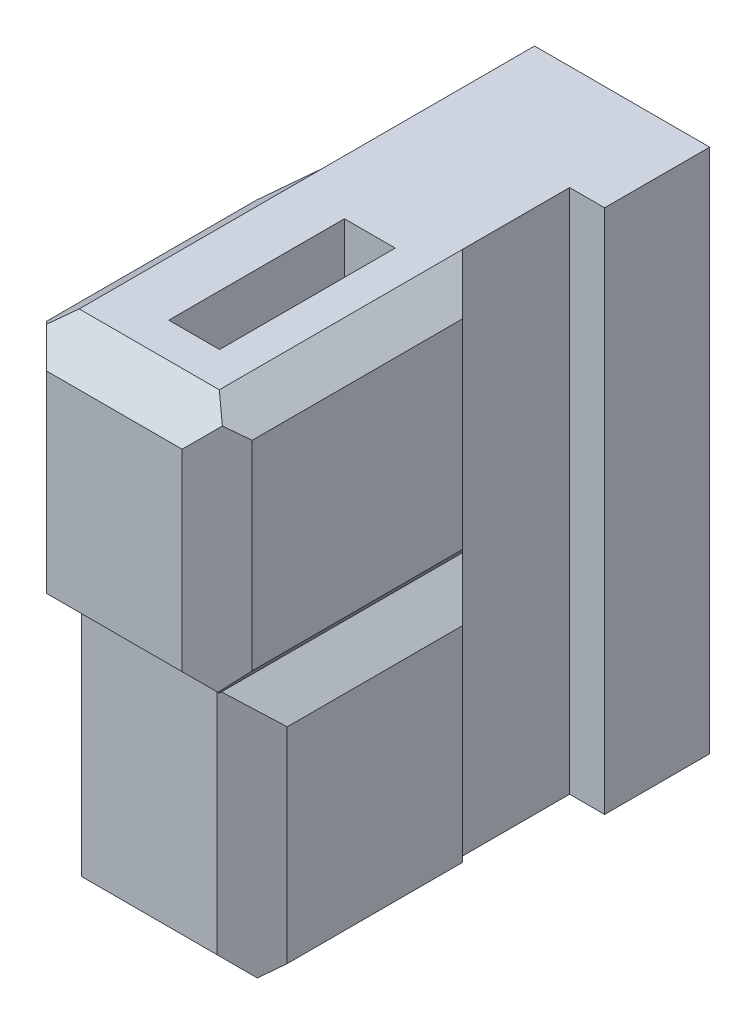
ISO-10303-21;
HEADER;
FILE_DESCRIPTION(('STEP AP214'),'2;1');
FILE_NAME('part.step','',(''),(''),'','','');
FILE_SCHEMA(('AUTOMOTIVE_DESIGN { 1 0 10303 214 1 1 1 1 }'));
ENDSEC;
DATA;
#1=APPLICATION_CONTEXT('core data for automotive mechanical design processes');
#2=APPLICATION_PROTOCOL_DEFINITION('international standard','automotive_design',2000,#1);
#3=PRODUCT_CONTEXT('',#1,'mechanical');
#4=PRODUCT('Part','Part','',(#3));
#5=PRODUCT_RELATED_PRODUCT_CATEGORY('part','',(#4));
#6=PRODUCT_DEFINITION_FORMATION('','',#4);
#7=PRODUCT_DEFINITION_CONTEXT('part definition',#1,'design');
#8=PRODUCT_DEFINITION('design','',#6,#7);
#9=PRODUCT_DEFINITION_SHAPE('','',#8);
#10=(LENGTH_UNIT() NAMED_UNIT(*) SI_UNIT(.MILLI.,.METRE.));
#11=(NAMED_UNIT(*) PLANE_ANGLE_UNIT() SI_UNIT($,.RADIAN.));
#12=(NAMED_UNIT(*) SI_UNIT($,.STERADIAN.) SOLID_ANGLE_UNIT());
#13=UNCERTAINTY_MEASURE_WITH_UNIT(LENGTH_MEASURE(1.E-05),#10,'distance_accuracy_value','');
#14=(GEOMETRIC_REPRESENTATION_CONTEXT(3) GLOBAL_UNCERTAINTY_ASSIGNED_CONTEXT((#13)) GLOBAL_UNIT_ASSIGNED_CONTEXT((#10,
#11,#12)) REPRESENTATION_CONTEXT('',''));
#15=CARTESIAN_POINT('',(0.,0.,0.));
#16=DIRECTION('',(0.,0.,1.));
#17=DIRECTION('',(1.,0.,0.));
#18=AXIS2_PLACEMENT_3D('',#15,#16,#17);
#19=CARTESIAN_POINT('',(3.68574548396804,12.5611885338296,13.));
#20=DIRECTION('',(-1.,0.,0.));
#21=DIRECTION('',(0.,-1.,0.));
#22=AXIS2_PLACEMENT_3D('',#19,#20,#21);
#23=PLANE('',#22);
#24=DIRECTION('',(0.,1.,0.));
#25=VECTOR('',#24,1.);
#26=CARTESIAN_POINT('',(3.68574548396804,12.5611885338296,6.06103746848479));
#27=LINE('',#26,#25);
#28=CARTESIAN_POINT('',(3.68574548396804,5.06118853382956,6.06103746848479));
#29=VERTEX_POINT('',#28);
#30=CARTESIAN_POINT('',(3.68574548396804,-2.43881146617044,6.06103746848479));
#31=VERTEX_POINT('',#30);
#32=EDGE_CURVE('E425',#29,#31,#27,.F.);
#33=ORIENTED_EDGE('',*,*,#32,.T.);
#34=DIRECTION('',(0.,0.,-1.));
#35=VECTOR('',#34,1.);
#36=CARTESIAN_POINT('',(3.68574548396804,-2.43881146617044,13.));
#37=LINE('',#36,#35);
#38=CARTESIAN_POINT('',(3.68574548396804,-2.43881146617044,3.));
#39=VERTEX_POINT('',#38);
#40=EDGE_CURVE('E336',#31,#39,#37,.T.);
#41=ORIENTED_EDGE('',*,*,#40,.T.);
#42=DIRECTION('',(0.,-1.,0.));
#43=VECTOR('',#42,1.);
#44=CARTESIAN_POINT('',(3.68574548396804,12.5611885338296,3.));
#45=LINE('',#44,#43);
#46=CARTESIAN_POINT('',(3.68574548396804,12.5611885338296,3.));
#47=VERTEX_POINT('',#46);
#48=EDGE_CURVE('E276',#47,#39,#45,.T.);
#49=ORIENTED_EDGE('',*,*,#48,.F.);
#50=DIRECTION('',(0.,0.,-1.));
#51=VECTOR('',#50,1.);
#52=CARTESIAN_POINT('',(3.68574548396804,12.5611885338296,13.));
#53=LINE('',#52,#51);
#54=CARTESIAN_POINT('',(3.68574548396804,12.5611885338296,6.06103746848479));
#55=VERTEX_POINT('',#54);
#56=EDGE_CURVE('E333',#55,#47,#53,.T.);
#57=ORIENTED_EDGE('',*,*,#56,.F.);
#58=DIRECTION('',(0.,1.,0.));
#59=VECTOR('',#58,1.);
#60=CARTESIAN_POINT('',(3.68574548396804,12.5611885338296,6.06103746848479));
#61=LINE('',#60,#59);
#62=EDGE_CURVE('E422',#55,#29,#61,.F.);
#63=ORIENTED_EDGE('',*,*,#62,.T.);
#64=EDGE_LOOP('',(#33,#41,#49,#57,#63));
#65=FACE_BOUND('',#64,.T.);
#66=ADVANCED_FACE('F34',(#65),#23,.F.);
#67=CARTESIAN_POINT('',(-0.31425451603196,12.5611885338296,13.));
#68=DIRECTION('',(1.,0.,0.));
#69=DIRECTION('',(0.,1.,0.));
#70=AXIS2_PLACEMENT_3D('',#67,#68,#69);
#71=PLANE('',#70);
#72=DIRECTION('',(0.,-1.,0.));
#73=VECTOR('',#72,1.);
#74=CARTESIAN_POINT('',(-0.31425451603196,12.5611885338296,6.06103746848479));
#75=LINE('',#74,#73);
#76=CARTESIAN_POINT('',(-0.314254516031959,5.06118853382956,6.06103746848479));
#77=VERTEX_POINT('',#76);
#78=CARTESIAN_POINT('',(-0.31425451603196,12.5611885338296,6.06103746848479));
#79=VERTEX_POINT('',#78);
#80=EDGE_CURVE('E438',#77,#79,#75,.F.);
#81=ORIENTED_EDGE('',*,*,#80,.T.);
#82=DIRECTION('',(0.,0.,-1.));
#83=VECTOR('',#82,1.);
#84=CARTESIAN_POINT('',(-0.31425451603196,12.5611885338296,13.));
#85=LINE('',#84,#83);
#86=CARTESIAN_POINT('',(-0.31425451603196,12.5611885338296,0.));
#87=VERTEX_POINT('',#86);
#88=EDGE_CURVE('E330',#79,#87,#85,.T.);
#89=ORIENTED_EDGE('',*,*,#88,.T.);
#90=DIRECTION('',(0.,-1.,0.));
#91=VECTOR('',#90,1.);
#92=CARTESIAN_POINT('',(-0.31425451603196,12.5611885338296,0.));
#93=LINE('',#92,#91);
#94=CARTESIAN_POINT('',(-0.314254516031958,-2.43881146617044,0.));
#95=VERTEX_POINT('',#94);
#96=EDGE_CURVE('E322',#87,#95,#93,.T.);
#97=ORIENTED_EDGE('',*,*,#96,.T.);
#98=DIRECTION('',(0.,0.,-1.));
#99=VECTOR('',#98,1.);
#100=CARTESIAN_POINT('',(-0.314254516031958,-2.43881146617044,13.));
#101=LINE('',#100,#99);
#102=CARTESIAN_POINT('',(-0.314254516031958,-2.43881146617044,6.06103746848479));
#103=VERTEX_POINT('',#102);
#104=EDGE_CURVE('E339',#103,#95,#101,.T.);
#105=ORIENTED_EDGE('',*,*,#104,.F.);
#106=DIRECTION('',(0.,-1.,0.));
#107=VECTOR('',#106,1.);
#108=CARTESIAN_POINT('',(-0.31425451603196,12.5611885338296,6.06103746848479));
#109=LINE('',#108,#107);
#110=EDGE_CURVE('E441',#103,#77,#109,.F.);
#111=ORIENTED_EDGE('',*,*,#110,.T.);
#112=EDGE_LOOP('',(#81,#89,#97,#105,#111));
#113=FACE_BOUND('',#112,.T.);
#114=ADVANCED_FACE('F518',(#113),#71,.F.);
#115=CARTESIAN_POINT('',(-0.314254516031958,-2.43881146617044,13.));
#116=DIRECTION('',(0.,1.,0.));
#117=DIRECTION('',(0.,0.,1.));
#118=AXIS2_PLACEMENT_3D('',#115,#116,#117);
#119=PLANE('',#118);
#120=DIRECTION('',(1.,0.,0.));
#121=VECTOR('',#120,1.);
#122=CARTESIAN_POINT('',(1.24324955469765,-2.43881146617044,6.98541748945029));
#123=LINE('',#122,#121);
#124=CARTESIAN_POINT('',(1.24324955469765,-2.43881146617044,6.98541748945029));
#125=VERTEX_POINT('',#124);
#126=CARTESIAN_POINT('',(2.69324955469765,-2.43881146617044,6.98541748945029));
#127=VERTEX_POINT('',#126);
#128=EDGE_CURVE('E241',#125,#127,#123,.T.);
#129=ORIENTED_EDGE('',*,*,#128,.F.);
#130=DIRECTION('',(0.,0.,-1.));
#131=VECTOR('',#130,1.);
#132=CARTESIAN_POINT('',(1.24324955469765,-2.43881146617044,12.));
#133=LINE('',#132,#131);
#134=CARTESIAN_POINT('',(1.24324955469765,-2.43881146617044,12.));
#135=VERTEX_POINT('',#134);
#136=EDGE_CURVE('E248',#135,#125,#133,.T.);
#137=ORIENTED_EDGE('',*,*,#136,.F.);
#138=DIRECTION('',(-1.,0.,0.));
#139=VECTOR('',#138,1.);
#140=CARTESIAN_POINT('',(-0.253217047547181,-2.43881146617044,12.));
#141=LINE('',#140,#139);
#142=CARTESIAN_POINT('',(-0.314254516031958,-2.43881146617044,12.));
#143=VERTEX_POINT('',#142);
#144=EDGE_CURVE('E463',#135,#143,#141,.T.);
#145=ORIENTED_EDGE('',*,*,#144,.T.);
#146=EDGE_CURVE('E340',#143,#103,#101,.T.);
#147=ORIENTED_EDGE('',*,*,#146,.T.);
#148=ORIENTED_EDGE('',*,*,#104,.T.);
#149=DIRECTION('',(1.,0.,0.));
#150=VECTOR('',#149,1.);
#151=CARTESIAN_POINT('',(-0.314254516031958,-2.43881146617044,0.));
#152=LINE('',#151,#150);
#153=CARTESIAN_POINT('',(4.68574548396804,-2.43881146617044,0.));
#154=VERTEX_POINT('',#153);
#155=EDGE_CURVE('E325',#95,#154,#152,.T.);
#156=ORIENTED_EDGE('',*,*,#155,.T.);
#157=DIRECTION('',(0.,0.,-1.));
#158=VECTOR('',#157,1.);
#159=CARTESIAN_POINT('',(4.68574548396804,-2.43881146617044,0.));
#160=LINE('',#159,#158);
#161=CARTESIAN_POINT('',(4.68574548396804,-2.43881146617044,3.));
#162=VERTEX_POINT('',#161);
#163=EDGE_CURVE('E311',#162,#154,#160,.T.);
#164=ORIENTED_EDGE('',*,*,#163,.F.);
#165=DIRECTION('',(-1.,0.,0.));
#166=VECTOR('',#165,1.);
#167=CARTESIAN_POINT('',(4.68574548396804,-2.43881146617044,3.));
#168=LINE('',#167,#166);
#169=EDGE_CURVE('E314',#162,#39,#168,.T.);
#170=ORIENTED_EDGE('',*,*,#169,.T.);
#171=ORIENTED_EDGE('',*,*,#40,.F.);
#172=CARTESIAN_POINT('',(3.68574548396804,-2.43881146617044,12.));
#173=VERTEX_POINT('',#172);
#174=EDGE_CURVE('E337',#173,#31,#37,.T.);
#175=ORIENTED_EDGE('',*,*,#174,.F.);
#176=CARTESIAN_POINT('',(2.69324955469765,-2.43881146617044,12.));
#177=VERTEX_POINT('',#176);
#178=EDGE_CURVE('E464',#173,#177,#141,.T.);
#179=ORIENTED_EDGE('',*,*,#178,.T.);
#180=DIRECTION('',(0.,0.,1.));
#181=VECTOR('',#180,1.);
#182=CARTESIAN_POINT('',(2.69324955469765,-2.43881146617044,12.));
#183=LINE('',#182,#181);
#184=EDGE_CURVE('E57',#127,#177,#183,.T.);
#185=ORIENTED_EDGE('',*,*,#184,.F.);
#186=EDGE_LOOP('',(#129,#137,#145,#147,#148,#156,#164,#170,#171,#175,#179,#185));
#187=FACE_BOUND('',#186,.T.);
#188=ADVANCED_FACE('F256',(#187),#119,.F.);
#189=CARTESIAN_POINT('',(-0.31425451603196,12.5611885338296,13.));
#190=DIRECTION('',(0.,-1.,0.));
#191=DIRECTION('',(0.,0.,-1.));
#192=AXIS2_PLACEMENT_3D('',#189,#190,#191);
#193=PLANE('',#192);
#194=DIRECTION('',(-1.,0.,0.));
#195=VECTOR('',#194,1.);
#196=CARTESIAN_POINT('',(-0.31425451603196,12.5611885338296,12.));
#197=LINE('',#196,#195);
#198=CARTESIAN_POINT('',(2.69324955469765,12.5611885338296,12.));
#199=VERTEX_POINT('',#198);
#200=CARTESIAN_POINT('',(1.24324955469765,12.5611885338296,12.));
#201=VERTEX_POINT('',#200);
#202=EDGE_CURVE('E263',#199,#201,#197,.T.);
#203=ORIENTED_EDGE('',*,*,#202,.T.);
#204=DIRECTION('',(0.,0.,-1.));
#205=VECTOR('',#204,1.);
#206=CARTESIAN_POINT('',(1.24324955469765,12.5611885338296,13.));
#207=LINE('',#206,#205);
#208=CARTESIAN_POINT('',(1.24324955469765,12.5611885338296,6.98541748945029));
#209=VERTEX_POINT('',#208);
#210=EDGE_CURVE('E11',#201,#209,#207,.T.);
#211=ORIENTED_EDGE('',*,*,#210,.T.);
#212=DIRECTION('',(1.,0.,0.));
#213=VECTOR('',#212,1.);
#214=CARTESIAN_POINT('',(-0.31425451603196,12.5611885338296,6.98541748945029));
#215=LINE('',#214,#213);
#216=CARTESIAN_POINT('',(2.69324955469765,12.5611885338296,6.98541748945029));
#217=VERTEX_POINT('',#216);
#218=EDGE_CURVE('E243',#209,#217,#215,.T.);
#219=ORIENTED_EDGE('',*,*,#218,.T.);
#220=DIRECTION('',(0.,0.,1.));
#221=VECTOR('',#220,1.);
#222=CARTESIAN_POINT('',(2.69324955469765,12.5611885338296,13.));
#223=LINE('',#222,#221);
#224=EDGE_CURVE('E43',#217,#199,#223,.T.);
#225=ORIENTED_EDGE('',*,*,#224,.T.);
#226=EDGE_LOOP('',(#203,#211,#219,#225));
#227=FACE_BOUND('',#226,.T.);
#228=CARTESIAN_POINT('',(-0.31425451603196,12.5611885338296,13.));
#229=VERTEX_POINT('',#228);
#230=EDGE_CURVE('E331',#229,#79,#85,.T.);
#231=ORIENTED_EDGE('',*,*,#230,.F.);
#232=DIRECTION('',(1.,0.,0.));
#233=VECTOR('',#232,1.);
#234=CARTESIAN_POINT('',(-0.31425451603196,12.5611885338296,13.));
#235=LINE('',#234,#233);
#236=CARTESIAN_POINT('',(3.68574548396804,12.5611885338296,13.));
#237=VERTEX_POINT('',#236);
#238=EDGE_CURVE('E450',#229,#237,#235,.T.);
#239=ORIENTED_EDGE('',*,*,#238,.T.);
#240=EDGE_CURVE('E334',#237,#55,#53,.T.);
#241=ORIENTED_EDGE('',*,*,#240,.T.);
#242=ORIENTED_EDGE('',*,*,#56,.T.);
#243=DIRECTION('',(-1.,0.,0.));
#244=VECTOR('',#243,1.);
#245=CARTESIAN_POINT('',(4.68574548396804,12.5611885338296,3.));
#246=LINE('',#245,#244);
#247=CARTESIAN_POINT('',(4.68574548396804,12.5611885338296,3.));
#248=VERTEX_POINT('',#247);
#249=EDGE_CURVE('E319',#248,#47,#246,.T.);
#250=ORIENTED_EDGE('',*,*,#249,.F.);
#251=DIRECTION('',(0.,0.,1.));
#252=VECTOR('',#251,1.);
#253=CARTESIAN_POINT('',(4.68574548396804,12.5611885338296,0.));
#254=LINE('',#253,#252);
#255=CARTESIAN_POINT('',(4.68574548396804,12.5611885338296,0.));
#256=VERTEX_POINT('',#255);
#257=EDGE_CURVE('E307',#256,#248,#254,.T.);
#258=ORIENTED_EDGE('',*,*,#257,.F.);
#259=DIRECTION('',(-1.,0.,0.));
#260=VECTOR('',#259,1.);
#261=CARTESIAN_POINT('',(-0.31425451603196,12.5611885338296,0.));
#262=LINE('',#261,#260);
#263=EDGE_CURVE('E327',#256,#87,#262,.T.);
#264=ORIENTED_EDGE('',*,*,#263,.T.);
#265=ORIENTED_EDGE('',*,*,#88,.F.);
#266=EDGE_LOOP('',(#231,#239,#241,#242,#250,#258,#264,#265));
#267=FACE_BOUND('',#266,.T.);
#268=ADVANCED_FACE('F472',(#227,#267),#193,.F.);
#269=CARTESIAN_POINT('',(0.,0.,13.));
#270=DIRECTION('',(0.,0.,1.));
#271=DIRECTION('',(1.,0.,0.));
#272=AXIS2_PLACEMENT_3D('',#269,#270,#271);
#273=PLANE('',#272);
#274=DIRECTION('',(0.,-1.,0.));
#275=VECTOR('',#274,1.);
#276=CARTESIAN_POINT('',(-0.253217047547181,0.,13.));
#277=LINE('',#276,#275);
#278=CARTESIAN_POINT('',(-0.253217047547181,5.06118853382956,13.));
#279=VERTEX_POINT('',#278);
#280=CARTESIAN_POINT('',(-0.253217047547181,-1.43881146617044,13.));
#281=VERTEX_POINT('',#280);
#282=EDGE_CURVE('E379',#279,#281,#277,.T.);
#283=ORIENTED_EDGE('',*,*,#282,.T.);
#284=DIRECTION('',(1.,0.,0.));
#285=VECTOR('',#284,1.);
#286=CARTESIAN_POINT('',(3.62470801548326,-1.43881146617044,13.));
#287=LINE('',#286,#285);
#288=CARTESIAN_POINT('',(3.62470801548326,-1.43881146617044,13.));
#289=VERTEX_POINT('',#288);
#290=EDGE_CURVE('E456',#281,#289,#287,.T.);
#291=ORIENTED_EDGE('',*,*,#290,.T.);
#292=DIRECTION('',(0.,1.,0.));
#293=VECTOR('',#292,1.);
#294=CARTESIAN_POINT('',(3.62470801548326,0.,13.));
#295=LINE('',#294,#293);
#296=CARTESIAN_POINT('',(3.62470801548326,5.06118853382956,13.));
#297=VERTEX_POINT('',#296);
#298=EDGE_CURVE('E382',#289,#297,#295,.T.);
#299=ORIENTED_EDGE('',*,*,#298,.T.);
#300=DIRECTION('',(1.,0.,0.));
#301=VECTOR('',#300,1.);
#302=CARTESIAN_POINT('',(-0.314254516031959,5.06118853382956,13.));
#303=LINE('',#302,#301);
#304=EDGE_CURVE('E269',#279,#297,#303,.T.);
#305=ORIENTED_EDGE('',*,*,#304,.F.);
#306=EDGE_LOOP('',(#283,#291,#299,#305));
#307=FACE_BOUND('',#306,.T.);
#308=ADVANCED_FACE('F494',(#307),#273,.T.);
#309=CARTESIAN_POINT('',(0.,0.,0.));
#310=DIRECTION('',(0.,0.,1.));
#311=DIRECTION('',(1.,0.,0.));
#312=AXIS2_PLACEMENT_3D('',#309,#310,#311);
#313=PLANE('',#312);
#314=ORIENTED_EDGE('',*,*,#96,.F.);
#315=ORIENTED_EDGE('',*,*,#263,.F.);
#316=DIRECTION('',(0.,1.,0.));
#317=VECTOR('',#316,1.);
#318=CARTESIAN_POINT('',(4.68574548396804,12.5611885338296,0.));
#319=LINE('',#318,#317);
#320=EDGE_CURVE('E304',#154,#256,#319,.T.);
#321=ORIENTED_EDGE('',*,*,#320,.F.);
#322=ORIENTED_EDGE('',*,*,#155,.F.);
#323=EDGE_LOOP('',(#314,#315,#321,#322));
#324=FACE_BOUND('',#323,.T.);
#325=ADVANCED_FACE('F522',(#324),#313,.F.);
#326=CARTESIAN_POINT('',(4.68574548396804,12.5611885338296,3.));
#327=DIRECTION('',(0.,0.,-1.));
#328=DIRECTION('',(0.,1.,0.));
#329=AXIS2_PLACEMENT_3D('',#326,#327,#328);
#330=PLANE('',#329);
#331=ORIENTED_EDGE('',*,*,#48,.T.);
#332=ORIENTED_EDGE('',*,*,#169,.F.);
#333=DIRECTION('',(0.,-1.,0.));
#334=VECTOR('',#333,1.);
#335=CARTESIAN_POINT('',(4.68574548396804,12.5611885338296,3.));
#336=LINE('',#335,#334);
#337=EDGE_CURVE('E309',#248,#162,#336,.T.);
#338=ORIENTED_EDGE('',*,*,#337,.F.);
#339=ORIENTED_EDGE('',*,*,#249,.T.);
#340=EDGE_LOOP('',(#331,#332,#338,#339));
#341=FACE_BOUND('',#340,.T.);
#342=ADVANCED_FACE('F532',(#341),#330,.F.);
#343=CARTESIAN_POINT('',(4.68574548396804,0.,0.));
#344=DIRECTION('',(-1.,0.,0.));
#345=DIRECTION('',(0.,-1.,0.));
#346=AXIS2_PLACEMENT_3D('',#343,#344,#345);
#347=PLANE('',#346);
#348=ORIENTED_EDGE('',*,*,#320,.T.);
#349=ORIENTED_EDGE('',*,*,#257,.T.);
#350=ORIENTED_EDGE('',*,*,#337,.T.);
#351=ORIENTED_EDGE('',*,*,#163,.T.);
#352=EDGE_LOOP('',(#348,#349,#350,#351));
#353=FACE_BOUND('',#352,.T.);
#354=ADVANCED_FACE('F527',(#353),#347,.F.);
#355=CARTESIAN_POINT('',(4.62470801548326,-1.65643513010278,6.));
#356=DIRECTION('',(0.640139761828641,-0.768258475596574,0.));
#357=DIRECTION('',(0.768258475596574,0.640139761828641,0.));
#358=AXIS2_PLACEMENT_3D('',#355,#356,#357);
#359=PLANE('',#358);
#360=DIRECTION('',(0.609226248130286,0.507628562216694,-0.609226248130288));
#361=VECTOR('',#360,1.);
#362=CARTESIAN_POINT('',(6.8516477439487,0.199128736315513,9.77306027153456));
#363=LINE('',#362,#361);
#364=CARTESIAN_POINT('',(4.62470801548326,-1.65643513010278,12.));
#365=VERTEX_POINT('',#364);
#366=CARTESIAN_POINT('',(4.19793436913944,-2.01203781982662,12.4267736463438));
#367=VERTEX_POINT('',#366);
#368=EDGE_CURVE('E374',#365,#367,#363,.F.);
#369=ORIENTED_EDGE('',*,*,#368,.T.);
#370=DIRECTION('',(-0.647041080495098,-0.539137199677287,-0.539137199677289));
#371=VECTOR('',#370,1.);
#372=CARTESIAN_POINT('',(2.25871729317026,-3.62786113525569,10.8109503309147));
#373=LINE('',#372,#371);
#374=EDGE_CURVE('E461',#367,#173,#373,.T.);
#375=ORIENTED_EDGE('',*,*,#374,.T.);
#376=ORIENTED_EDGE('',*,*,#174,.T.);
#377=DIRECTION('',(-0.609226248130284,-0.507628562216692,-0.609226248130291));
#378=VECTOR('',#377,1.);
#379=CARTESIAN_POINT('',(4.25355139407235,-1.96569577450584,6.6288433785891));
#380=LINE('',#379,#378);
#381=CARTESIAN_POINT('',(4.62470801548326,-1.65643513010278,7.00000000000002));
#382=VERTEX_POINT('',#381);
#383=EDGE_CURVE('E377',#31,#382,#380,.F.);
#384=ORIENTED_EDGE('',*,*,#383,.T.);
#385=DIRECTION('',(0.,0.,1.));
#386=VECTOR('',#385,1.);
#387=CARTESIAN_POINT('',(4.62470801548326,-1.65643513010278,6.));
#388=LINE('',#387,#386);
#389=EDGE_CURVE('E286',#382,#365,#388,.T.);
#390=ORIENTED_EDGE('',*,*,#389,.T.);
#391=EDGE_LOOP('',(#369,#375,#376,#384,#390));
#392=FACE_BOUND('',#391,.T.);
#393=ADVANCED_FACE('F485',(#392),#359,.T.);
#394=CARTESIAN_POINT('',(4.62470801548326,4.19760023647882,6.));
#395=DIRECTION('',(1.,0.,0.));
#396=DIRECTION('',(0.,1.,0.));
#397=AXIS2_PLACEMENT_3D('',#394,#395,#396);
#398=PLANE('',#397);
#399=ORIENTED_EDGE('',*,*,#389,.F.);
#400=DIRECTION('',(0.,1.,0.));
#401=VECTOR('',#400,1.);
#402=CARTESIAN_POINT('',(4.62470801548326,4.19760023647882,7.00000000000002));
#403=LINE('',#402,#401);
#404=CARTESIAN_POINT('',(4.62470801548326,4.19760023647882,7.00000000000002));
#405=VERTEX_POINT('',#404);
#406=EDGE_CURVE('E371',#382,#405,#403,.T.);
#407=ORIENTED_EDGE('',*,*,#406,.T.);
#408=DIRECTION('',(0.,0.,1.));
#409=VECTOR('',#408,1.);
#410=CARTESIAN_POINT('',(4.62470801548326,4.19760023647882,6.));
#411=LINE('',#410,#409);
#412=CARTESIAN_POINT('',(4.62470801548326,4.19760023647882,12.));
#413=VERTEX_POINT('',#412);
#414=EDGE_CURVE('E283',#405,#413,#411,.T.);
#415=ORIENTED_EDGE('',*,*,#414,.T.);
#416=DIRECTION('',(0.,-1.,0.));
#417=VECTOR('',#416,1.);
#418=CARTESIAN_POINT('',(4.62470801548326,4.19760023647882,12.));
#419=LINE('',#418,#417);
#420=EDGE_CURVE('E369',#413,#365,#419,.T.);
#421=ORIENTED_EDGE('',*,*,#420,.T.);
#422=EDGE_LOOP('',(#399,#407,#415,#421));
#423=FACE_BOUND('',#422,.T.);
#424=ADVANCED_FACE('F542',(#423),#398,.T.);
#425=CARTESIAN_POINT('',(3.68574548396804,5.06118853382956,6.));
#426=DIRECTION('',(0.676947317310232,0.736031473230921,0.));
#427=DIRECTION('',(-0.736031473230921,0.676947317310232,0.));
#428=AXIS2_PLACEMENT_3D('',#425,#426,#427);
#429=PLANE('',#428);
#430=ORIENTED_EDGE('',*,*,#414,.F.);
#431=DIRECTION('',(0.592775829963962,-0.545191370824103,0.592775829963968));
#432=VECTOR('',#431,1.);
#433=CARTESIAN_POINT('',(3.66429794391258,5.08091439506172,6.03958992842932));
#434=LINE('',#433,#432);
#435=EDGE_CURVE('E362',#405,#29,#434,.F.);
#436=ORIENTED_EDGE('',*,*,#435,.T.);
#437=DIRECTION('',(0.,0.,1.));
#438=VECTOR('',#437,1.);
#439=CARTESIAN_POINT('',(3.68574548396804,5.06118853382956,6.));
#440=LINE('',#439,#438);
#441=CARTESIAN_POINT('',(3.68574548396804,5.06118853382956,12.9389625315152));
#442=VERTEX_POINT('',#441);
#443=EDGE_CURVE('E282',#29,#442,#440,.T.);
#444=ORIENTED_EDGE('',*,*,#443,.T.);
#445=DIRECTION('',(-0.592775829963964,0.545191370824104,0.592775829963966));
#446=VECTOR('',#445,1.);
#447=CARTESIAN_POINT('',(6.12398023603885,2.81868052375556,10.5007277794444));
#448=LINE('',#447,#446);
#449=EDGE_CURVE('E360',#442,#413,#448,.F.);
#450=ORIENTED_EDGE('',*,*,#449,.T.);
#451=EDGE_LOOP('',(#430,#436,#444,#450));
#452=FACE_BOUND('',#451,.T.);
#453=ADVANCED_FACE('F545',(#452),#429,.T.);
#454=CARTESIAN_POINT('',(4.62470801548326,6.08210398427526,6.));
#455=DIRECTION('',(0.736031473230921,-0.676947317310232,0.));
#456=DIRECTION('',(0.676947317310232,0.736031473230921,0.));
#457=AXIS2_PLACEMENT_3D('',#454,#455,#456);
#458=PLANE('',#457);
#459=ORIENTED_EDGE('',*,*,#443,.F.);
#460=DIRECTION('',(-0.560580177517939,-0.609507776117668,-0.560580177517945));
#461=VECTOR('',#460,1.);
#462=CARTESIAN_POINT('',(4.3104578800572,5.74042600694064,6.68574986457396));
#463=LINE('',#462,#461);
#464=CARTESIAN_POINT('',(4.62470801548326,6.08210398427526,7.00000000000002));
#465=VERTEX_POINT('',#464);
#466=EDGE_CURVE('E367',#29,#465,#463,.F.);
#467=ORIENTED_EDGE('',*,*,#466,.T.);
#468=DIRECTION('',(0.,0.,1.));
#469=VECTOR('',#468,1.);
#470=CARTESIAN_POINT('',(4.62470801548326,6.08210398427526,6.));
#471=LINE('',#470,#469);
#472=CARTESIAN_POINT('',(4.62470801548326,6.08210398427526,13.));
#473=VERTEX_POINT('',#472);
#474=EDGE_CURVE('E277',#465,#473,#471,.T.);
#475=ORIENTED_EDGE('',*,*,#474,.T.);
#476=DIRECTION('',(-0.560580177517941,-0.609507776117669,0.560580177517943));
#477=VECTOR('',#476,1.);
#478=CARTESIAN_POINT('',(6.82445896346558,8.47384982561752,10.8002490520177));
#479=LINE('',#478,#477);
#480=CARTESIAN_POINT('',(4.13559524181232,5.55030130750049,13.4891127736709));
#481=VERTEX_POINT('',#480);
#482=EDGE_CURVE('E365',#473,#481,#479,.T.);
#483=ORIENTED_EDGE('',*,*,#482,.T.);
#484=DIRECTION('',(0.545191370824104,0.592775829963963,0.592775829963966));
#485=VECTOR('',#484,1.);
#486=CARTESIAN_POINT('',(2.0325384996431,3.26368916997479,11.2025006361452));
#487=LINE('',#486,#485);
#488=CARTESIAN_POINT('',(3.65650290026984,5.02939364904298,12.9682051152134));
#489=VERTEX_POINT('',#488);
#490=EDGE_CURVE('E345',#481,#489,#487,.F.);
#491=ORIENTED_EDGE('',*,*,#490,.T.);
#492=DIRECTION('',(-0.56058017751794,-0.609507776117669,0.560580177517943));
#493=VECTOR('',#492,1.);
#494=CARTESIAN_POINT('',(1.91808675734524,3.13924804679838,14.706621258138));
#495=LINE('',#494,#493);
#496=EDGE_CURVE('E431',#489,#442,#495,.F.);
#497=ORIENTED_EDGE('',*,*,#496,.T.);
#498=EDGE_LOOP('',(#459,#467,#475,#483,#491,#497));
#499=FACE_BOUND('',#498,.T.);
#500=ADVANCED_FACE('F550',(#499),#458,.T.);
#501=CARTESIAN_POINT('',(4.62470801548326,11.7821039842753,6.));
#502=DIRECTION('',(1.,0.,0.));
#503=DIRECTION('',(0.,1.,0.));
#504=AXIS2_PLACEMENT_3D('',#501,#502,#503);
#505=PLANE('',#504);
#506=ORIENTED_EDGE('',*,*,#474,.F.);
#507=DIRECTION('',(0.,1.,0.));
#508=VECTOR('',#507,1.);
#509=CARTESIAN_POINT('',(4.62470801548326,11.7821039842753,7.00000000000002));
#510=LINE('',#509,#508);
#511=CARTESIAN_POINT('',(4.62470801548326,11.7821039842753,7.00000000000002));
#512=VERTEX_POINT('',#511);
#513=EDGE_CURVE('E352',#465,#512,#510,.T.);
#514=ORIENTED_EDGE('',*,*,#513,.T.);
#515=DIRECTION('',(0.,0.,1.));
#516=VECTOR('',#515,1.);
#517=CARTESIAN_POINT('',(4.62470801548326,11.7821039842753,6.));
#518=LINE('',#517,#516);
#519=CARTESIAN_POINT('',(4.62470801548326,11.7821039842753,13.));
#520=VERTEX_POINT('',#519);
#521=EDGE_CURVE('E273',#512,#520,#518,.T.);
#522=ORIENTED_EDGE('',*,*,#521,.T.);
#523=DIRECTION('',(0.,-1.,0.));
#524=VECTOR('',#523,1.);
#525=CARTESIAN_POINT('',(4.62470801548326,6.08210398427526,13.));
#526=LINE('',#525,#524);
#527=EDGE_CURVE('E350',#520,#473,#526,.T.);
#528=ORIENTED_EDGE('',*,*,#527,.T.);
#529=EDGE_LOOP('',(#506,#514,#522,#528));
#530=FACE_BOUND('',#529,.T.);
#531=ADVANCED_FACE('F558',(#530),#505,.T.);
#532=CARTESIAN_POINT('',(4.62470801548326,11.7821039842753,6.));
#533=DIRECTION('',(0.638545980128091,0.769583673983703,0.));
#534=DIRECTION('',(-0.769583673983703,0.638545980128091,0.));
#535=AXIS2_PLACEMENT_3D('',#532,#533,#534);
#536=PLANE('',#535);
#537=ORIENTED_EDGE('',*,*,#240,.F.);
#538=DIRECTION('',(-0.648626175911402,0.538184022395013,-0.538184022395012));
#539=VECTOR('',#538,1.);
#540=CARTESIAN_POINT('',(1.90918327985121,14.0352539177976,11.525934616032));
#541=LINE('',#540,#539);
#542=CARTESIAN_POINT('',(4.19891572551963,12.1353962438659,13.4257922899636));
#543=VERTEX_POINT('',#542);
#544=EDGE_CURVE('E452',#237,#543,#541,.F.);
#545=ORIENTED_EDGE('',*,*,#544,.T.);
#546=DIRECTION('',(0.60988645125398,-0.506040544970115,-0.609886451253982));
#547=VECTOR('',#546,1.);
#548=CARTESIAN_POINT('',(7.22843839944548,9.62171307913808,10.3962696160378));
#549=LINE('',#548,#547);
#550=EDGE_CURVE('E355',#543,#520,#549,.T.);
#551=ORIENTED_EDGE('',*,*,#550,.T.);
#552=ORIENTED_EDGE('',*,*,#521,.F.);
#553=DIRECTION('',(0.609886451253979,-0.506040544970113,0.609886451253985));
#554=VECTOR('',#553,1.);
#555=CARTESIAN_POINT('',(4.25274653206007,12.0907312564377,6.62803851657683));
#556=LINE('',#555,#554);
#557=EDGE_CURVE('E357',#512,#55,#556,.F.);
#558=ORIENTED_EDGE('',*,*,#557,.T.);
#559=EDGE_LOOP('',(#537,#545,#551,#552,#558));
#560=FACE_BOUND('',#559,.T.);
#561=ADVANCED_FACE('F562',(#560),#536,.T.);
#562=CARTESIAN_POINT('',(-1.25321704754718,11.7821039842753,6.));
#563=DIRECTION('',(-0.638545980128091,0.769583673983703,0.));
#564=DIRECTION('',(-0.769583673983703,-0.638545980128091,0.));
#565=AXIS2_PLACEMENT_3D('',#562,#563,#564);
#566=PLANE('',#565);
#567=DIRECTION('',(0.60988645125398,0.506040544970115,0.609886451253982));
#568=VECTOR('',#567,1.);
#569=CARTESIAN_POINT('',(-3.8569474315094,9.62171307913808,10.3962696160378));
#570=LINE('',#569,#568);
#571=CARTESIAN_POINT('',(-1.25321704754718,11.7821039842753,13.));
#572=VERTEX_POINT('',#571);
#573=CARTESIAN_POINT('',(-0.827424757583561,12.1353962438659,13.4257922899636));
#574=VERTEX_POINT('',#573);
#575=EDGE_CURVE('E405',#572,#574,#570,.T.);
#576=ORIENTED_EDGE('',*,*,#575,.T.);
#577=DIRECTION('',(-0.648626175911402,-0.538184022395013,0.538184022395012));
#578=VECTOR('',#577,1.);
#579=CARTESIAN_POINT('',(1.46230768808487,14.0352539177976,11.525934616032));
#580=LINE('',#579,#578);
#581=EDGE_CURVE('E448',#574,#229,#580,.F.);
#582=ORIENTED_EDGE('',*,*,#581,.T.);
#583=ORIENTED_EDGE('',*,*,#230,.T.);
#584=DIRECTION('',(0.609886451253979,0.506040544970113,-0.609886451253985));
#585=VECTOR('',#584,1.);
#586=CARTESIAN_POINT('',(-0.881255564123996,12.0907312564377,6.62803851657683));
#587=LINE('',#586,#585);
#588=CARTESIAN_POINT('',(-1.25321704754718,11.7821039842753,7.00000000000002));
#589=VERTEX_POINT('',#588);
#590=EDGE_CURVE('E403',#79,#589,#587,.F.);
#591=ORIENTED_EDGE('',*,*,#590,.T.);
#592=DIRECTION('',(0.,0.,1.));
#593=VECTOR('',#592,1.);
#594=CARTESIAN_POINT('',(-1.25321704754718,11.7821039842753,6.));
#595=LINE('',#594,#593);
#596=EDGE_CURVE('E272',#589,#572,#595,.T.);
#597=ORIENTED_EDGE('',*,*,#596,.T.);
#598=EDGE_LOOP('',(#576,#582,#583,#591,#597));
#599=FACE_BOUND('',#598,.T.);
#600=ADVANCED_FACE('F717',(#599),#566,.T.);
#601=CARTESIAN_POINT('',(-1.25321704754718,-1.65643513010278,6.));
#602=DIRECTION('',(-0.640139761828641,-0.768258475596574,0.));
#603=DIRECTION('',(0.768258475596574,-0.640139761828641,0.));
#604=AXIS2_PLACEMENT_3D('',#601,#602,#603);
#605=PLANE('',#604);
#606=ORIENTED_EDGE('',*,*,#146,.F.);
#607=DIRECTION('',(-0.647041080495098,0.539137199677287,0.539137199677289));
#608=VECTOR('',#607,1.);
#609=CARTESIAN_POINT('',(1.11277367476582,-3.62786113525569,10.8109503309147));
#610=LINE('',#609,#608);
#611=CARTESIAN_POINT('',(-0.826443401203355,-2.01203781982662,12.4267736463438));
#612=VERTEX_POINT('',#611);
#613=EDGE_CURVE('E466',#143,#612,#610,.T.);
#614=ORIENTED_EDGE('',*,*,#613,.T.);
#615=DIRECTION('',(0.609226248130286,-0.507628562216694,0.609226248130288));
#616=VECTOR('',#615,1.);
#617=CARTESIAN_POINT('',(-3.48015677601261,0.199128736315512,9.77306027153456));
#618=LINE('',#617,#616);
#619=CARTESIAN_POINT('',(-1.25321704754718,-1.65643513010278,12.));
#620=VERTEX_POINT('',#619);
#621=EDGE_CURVE('E411',#612,#620,#618,.F.);
#622=ORIENTED_EDGE('',*,*,#621,.T.);
#623=DIRECTION('',(0.,0.,1.));
#624=VECTOR('',#623,1.);
#625=CARTESIAN_POINT('',(-1.25321704754718,-1.65643513010278,6.));
#626=LINE('',#625,#624);
#627=CARTESIAN_POINT('',(-1.25321704754718,-1.65643513010278,7.00000000000002));
#628=VERTEX_POINT('',#627);
#629=EDGE_CURVE('E289',#628,#620,#626,.T.);
#630=ORIENTED_EDGE('',*,*,#629,.F.);
#631=DIRECTION('',(-0.609226248130285,0.507628562216693,0.609226248130291));
#632=VECTOR('',#631,1.);
#633=CARTESIAN_POINT('',(-0.882060426136264,-1.96569577450584,6.6288433785891));
#634=LINE('',#633,#632);
#635=EDGE_CURVE('E408',#628,#103,#634,.F.);
#636=ORIENTED_EDGE('',*,*,#635,.T.);
#637=EDGE_LOOP('',(#606,#614,#622,#630,#636));
#638=FACE_BOUND('',#637,.T.);
#639=ADVANCED_FACE('F512',(#638),#605,.T.);
#640=CARTESIAN_POINT('',(-1.25321704754718,4.19760023647882,6.));
#641=DIRECTION('',(-1.,0.,0.));
#642=DIRECTION('',(0.,0.,1.));
#643=AXIS2_PLACEMENT_3D('',#640,#641,#642);
#644=PLANE('',#643);
#645=ORIENTED_EDGE('',*,*,#629,.T.);
#646=DIRECTION('',(0.,1.,0.));
#647=VECTOR('',#646,1.);
#648=CARTESIAN_POINT('',(-1.25321704754718,4.19760023647882,12.));
#649=LINE('',#648,#647);
#650=CARTESIAN_POINT('',(-1.25321704754718,4.19760023647882,12.));
#651=VERTEX_POINT('',#650);
#652=EDGE_CURVE('E416',#620,#651,#649,.T.);
#653=ORIENTED_EDGE('',*,*,#652,.T.);
#654=DIRECTION('',(0.,0.,1.));
#655=VECTOR('',#654,1.);
#656=CARTESIAN_POINT('',(-1.25321704754718,4.19760023647882,6.));
#657=LINE('',#656,#655);
#658=CARTESIAN_POINT('',(-1.25321704754718,4.19760023647882,7.00000000000002));
#659=VERTEX_POINT('',#658);
#660=EDGE_CURVE('E292',#659,#651,#657,.T.);
#661=ORIENTED_EDGE('',*,*,#660,.F.);
#662=DIRECTION('',(0.,-1.,0.));
#663=VECTOR('',#662,1.);
#664=CARTESIAN_POINT('',(-1.25321704754718,4.19760023647882,7.00000000000002));
#665=LINE('',#664,#663);
#666=EDGE_CURVE('E413',#659,#628,#665,.T.);
#667=ORIENTED_EDGE('',*,*,#666,.T.);
#668=EDGE_LOOP('',(#645,#653,#661,#667));
#669=FACE_BOUND('',#668,.T.);
#670=ADVANCED_FACE('F599',(#669),#644,.T.);
#671=CARTESIAN_POINT('',(-0.314254516031959,5.06118853382956,6.));
#672=DIRECTION('',(-0.676947317310232,0.736031473230921,0.));
#673=DIRECTION('',(-0.736031473230921,-0.676947317310232,0.));
#674=AXIS2_PLACEMENT_3D('',#671,#672,#673);
#675=PLANE('',#674);
#676=ORIENTED_EDGE('',*,*,#660,.T.);
#677=DIRECTION('',(-0.592775829963963,-0.545191370824104,-0.592775829963966));
#678=VECTOR('',#677,1.);
#679=CARTESIAN_POINT('',(-2.75248926810277,2.81868052375556,10.5007277794444));
#680=LINE('',#679,#678);
#681=CARTESIAN_POINT('',(-0.314254516031959,5.06118853382956,12.9389625315152));
#682=VERTEX_POINT('',#681);
#683=EDGE_CURVE('E420',#651,#682,#680,.F.);
#684=ORIENTED_EDGE('',*,*,#683,.T.);
#685=DIRECTION('',(0.,0.,1.));
#686=VECTOR('',#685,1.);
#687=CARTESIAN_POINT('',(-0.314254516031959,5.06118853382956,6.));
#688=LINE('',#687,#686);
#689=EDGE_CURVE('E298',#77,#682,#688,.T.);
#690=ORIENTED_EDGE('',*,*,#689,.F.);
#691=DIRECTION('',(0.592775829963962,0.545191370824103,-0.592775829963968));
#692=VECTOR('',#691,1.);
#693=CARTESIAN_POINT('',(-0.292806975976495,5.08091439506172,6.03958992842932));
#694=LINE('',#693,#692);
#695=EDGE_CURVE('E418',#77,#659,#694,.F.);
#696=ORIENTED_EDGE('',*,*,#695,.T.);
#697=EDGE_LOOP('',(#676,#684,#690,#696));
#698=FACE_BOUND('',#697,.T.);
#699=ADVANCED_FACE('F593',(#698),#675,.T.);
#700=CARTESIAN_POINT('',(-1.25321704754718,6.08210398427526,6.));
#701=DIRECTION('',(-0.736031473230921,-0.676947317310232,0.));
#702=DIRECTION('',(0.676947317310232,-0.736031473230921,0.));
#703=AXIS2_PLACEMENT_3D('',#700,#701,#702);
#704=PLANE('',#703);
#705=DIRECTION('',(0.545191370824104,-0.592775829963963,-0.592775829963966));
#706=VECTOR('',#705,1.);
#707=CARTESIAN_POINT('',(1.33895246829298,3.26368916997479,11.2025006361452));
#708=LINE('',#707,#706);
#709=CARTESIAN_POINT('',(-0.285011932333762,5.02939364904298,12.9682051152134));
#710=VERTEX_POINT('',#709);
#711=CARTESIAN_POINT('',(-0.764104273876245,5.55030130750049,13.4891127736709));
#712=VERTEX_POINT('',#711);
#713=EDGE_CURVE('E347',#710,#712,#708,.F.);
#714=ORIENTED_EDGE('',*,*,#713,.T.);
#715=DIRECTION('',(-0.560580177517941,0.609507776117669,-0.560580177517942));
#716=VECTOR('',#715,1.);
#717=CARTESIAN_POINT('',(-3.4529679955295,8.47384982561752,10.8002490520177));
#718=LINE('',#717,#716);
#719=CARTESIAN_POINT('',(-1.25321704754718,6.08210398427526,13.));
#720=VERTEX_POINT('',#719);
#721=EDGE_CURVE('E396',#712,#720,#718,.T.);
#722=ORIENTED_EDGE('',*,*,#721,.T.);
#723=DIRECTION('',(0.,0.,1.));
#724=VECTOR('',#723,1.);
#725=CARTESIAN_POINT('',(-1.25321704754718,6.08210398427526,6.));
#726=LINE('',#725,#724);
#727=CARTESIAN_POINT('',(-1.25321704754718,6.08210398427526,7.00000000000002));
#728=VERTEX_POINT('',#727);
#729=EDGE_CURVE('E299',#728,#720,#726,.T.);
#730=ORIENTED_EDGE('',*,*,#729,.F.);
#731=DIRECTION('',(-0.560580177517939,0.609507776117668,0.560580177517945));
#732=VECTOR('',#731,1.);
#733=CARTESIAN_POINT('',(-0.938966912121124,5.74042600694064,6.68574986457396));
#734=LINE('',#733,#732);
#735=EDGE_CURVE('E393',#728,#77,#734,.F.);
#736=ORIENTED_EDGE('',*,*,#735,.T.);
#737=ORIENTED_EDGE('',*,*,#689,.T.);
#738=DIRECTION('',(-0.560580177517941,0.609507776117669,-0.560580177517943));
#739=VECTOR('',#738,1.);
#740=CARTESIAN_POINT('',(1.45340421059085,3.13924804679838,14.706621258138));
#741=LINE('',#740,#739);
#742=EDGE_CURVE('E433',#682,#710,#741,.F.);
#743=ORIENTED_EDGE('',*,*,#742,.T.);
#744=EDGE_LOOP('',(#714,#722,#730,#736,#737,#743));
#745=FACE_BOUND('',#744,.T.);
#746=ADVANCED_FACE('F587',(#745),#704,.T.);
#747=CARTESIAN_POINT('',(-1.25321704754718,11.7821039842753,6.));
#748=DIRECTION('',(-1.,0.,0.));
#749=DIRECTION('',(0.,-1.,0.));
#750=AXIS2_PLACEMENT_3D('',#747,#748,#749);
#751=PLANE('',#750);
#752=ORIENTED_EDGE('',*,*,#729,.T.);
#753=DIRECTION('',(0.,1.,0.));
#754=VECTOR('',#753,1.);
#755=CARTESIAN_POINT('',(-1.25321704754718,11.7821039842753,13.));
#756=LINE('',#755,#754);
#757=EDGE_CURVE('E401',#720,#572,#756,.T.);
#758=ORIENTED_EDGE('',*,*,#757,.T.);
#759=ORIENTED_EDGE('',*,*,#596,.F.);
#760=DIRECTION('',(0.,-1.,0.));
#761=VECTOR('',#760,1.);
#762=CARTESIAN_POINT('',(-1.25321704754718,11.7821039842753,7.00000000000002));
#763=LINE('',#762,#761);
#764=EDGE_CURVE('E398',#589,#728,#763,.T.);
#765=ORIENTED_EDGE('',*,*,#764,.T.);
#766=EDGE_LOOP('',(#752,#758,#759,#765));
#767=FACE_BOUND('',#766,.T.);
#768=ADVANCED_FACE('F750',(#767),#751,.T.);
#769=CARTESIAN_POINT('',(0.,0.,14.));
#770=DIRECTION('',(0.,0.,-1.));
#771=DIRECTION('',(-1.,0.,0.));
#772=AXIS2_PLACEMENT_3D('',#769,#770,#771);
#773=PLANE('',#772);
#774=DIRECTION('',(0.,1.,0.));
#775=VECTOR('',#774,1.);
#776=CARTESIAN_POINT('',(3.62470801548325,11.7821039842753,14.));
#777=LINE('',#776,#775);
#778=CARTESIAN_POINT('',(3.62470801548326,6.06118853382956,14.));
#779=VERTEX_POINT('',#778);
#780=CARTESIAN_POINT('',(3.62470801548325,11.5611885338296,14.));
#781=VERTEX_POINT('',#780);
#782=EDGE_CURVE('E386',#779,#781,#777,.T.);
#783=ORIENTED_EDGE('',*,*,#782,.T.);
#784=DIRECTION('',(-1.,0.,0.));
#785=VECTOR('',#784,1.);
#786=CARTESIAN_POINT('',(0.,11.5611885338296,14.));
#787=LINE('',#786,#785);
#788=CARTESIAN_POINT('',(-0.253217047547179,11.5611885338296,14.));
#789=VERTEX_POINT('',#788);
#790=EDGE_CURVE('E443',#781,#789,#787,.T.);
#791=ORIENTED_EDGE('',*,*,#790,.T.);
#792=DIRECTION('',(0.,-1.,0.));
#793=VECTOR('',#792,1.);
#794=CARTESIAN_POINT('',(-0.253217047547178,6.08210398427526,14.));
#795=LINE('',#794,#793);
#796=CARTESIAN_POINT('',(-0.253217047547178,6.06118853382956,14.));
#797=VERTEX_POINT('',#796);
#798=EDGE_CURVE('E384',#789,#797,#795,.T.);
#799=ORIENTED_EDGE('',*,*,#798,.T.);
#800=DIRECTION('',(1.,0.,0.));
#801=VECTOR('',#800,1.);
#802=CARTESIAN_POINT('',(0.,6.06118853382956,14.));
#803=LINE('',#802,#801);
#804=EDGE_CURVE('E342',#797,#779,#803,.T.);
#805=ORIENTED_EDGE('',*,*,#804,.T.);
#806=EDGE_LOOP('',(#783,#791,#799,#805));
#807=FACE_BOUND('',#806,.T.);
#808=ADVANCED_FACE('F577',(#807),#773,.F.);
#809=CARTESIAN_POINT('',(0.,6.06118853382956,14.));
#810=DIRECTION('',(0.,0.707106781186549,-0.707106781186546));
#811=DIRECTION('',(1.,0.,0.));
#812=AXIS2_PLACEMENT_3D('',#809,#810,#811);
#813=PLANE('',#812);
#814=ORIENTED_EDGE('',*,*,#490,.F.);
#815=DIRECTION('',(0.577350269189625,-0.577350269189625,-0.577350269189627));
#816=VECTOR('',#815,1.);
#817=CARTESIAN_POINT('',(2.41647201032217,7.26942453899064,15.2082360051611));
#818=LINE('',#817,#816);
#819=EDGE_CURVE('E391',#481,#779,#818,.F.);
#820=ORIENTED_EDGE('',*,*,#819,.T.);
#821=ORIENTED_EDGE('',*,*,#804,.F.);
#822=DIRECTION('',(0.577350269189625,0.577350269189625,0.577350269189627));
#823=VECTOR('',#822,1.);
#824=CARTESIAN_POINT('',(-0.168811365031452,6.14559421634529,14.0844056825157));
#825=LINE('',#824,#823);
#826=EDGE_CURVE('E389',#797,#712,#825,.F.);
#827=ORIENTED_EDGE('',*,*,#826,.T.);
#828=ORIENTED_EDGE('',*,*,#713,.F.);
#829=DIRECTION('',(0.577350269189625,0.577350269189625,0.577350269189627));
#830=VECTOR('',#829,1.);
#831=CARTESIAN_POINT('',(-1.94027989215703,3.37412568921971,11.3129371553901));
#832=LINE('',#831,#830);
#833=EDGE_CURVE('E436',#710,#279,#832,.T.);
#834=ORIENTED_EDGE('',*,*,#833,.T.);
#835=ORIENTED_EDGE('',*,*,#304,.T.);
#836=DIRECTION('',(0.577350269189625,-0.577350269189625,-0.577350269189627));
#837=VECTOR('',#836,1.);
#838=CARTESIAN_POINT('',(5.31177086009311,3.37412568921971,11.3129371553901));
#839=LINE('',#838,#837);
#840=EDGE_CURVE('E428',#297,#489,#839,.T.);
#841=ORIENTED_EDGE('',*,*,#840,.T.);
#842=EDGE_LOOP('',(#814,#820,#821,#827,#828,#834,#835,#841));
#843=FACE_BOUND('',#842,.T.);
#844=ADVANCED_FACE('F503',(#843),#813,.F.);
#845=CARTESIAN_POINT('',(4.62470801548326,11.7821039842753,7.00000000000002));
#846=DIRECTION('',(-0.707106781186551,0.,0.707106781186544));
#847=DIRECTION('',(0.,1.,0.));
#848=AXIS2_PLACEMENT_3D('',#845,#846,#847);
#849=PLANE('',#848);
#850=ORIENTED_EDGE('',*,*,#466,.F.);
#851=ORIENTED_EDGE('',*,*,#62,.F.);
#852=ORIENTED_EDGE('',*,*,#557,.F.);
#853=ORIENTED_EDGE('',*,*,#513,.F.);
#854=EDGE_LOOP('',(#850,#851,#852,#853));
#855=FACE_BOUND('',#854,.T.);
#856=ADVANCED_FACE('F555',(#855),#849,.F.);
#857=CARTESIAN_POINT('',(4.62470801548326,4.19760023647882,7.00000000000002));
#858=DIRECTION('',(-0.707106781186551,0.,0.707106781186544));
#859=DIRECTION('',(0.,1.,0.));
#860=AXIS2_PLACEMENT_3D('',#857,#858,#859);
#861=PLANE('',#860);
#862=ORIENTED_EDGE('',*,*,#383,.F.);
#863=ORIENTED_EDGE('',*,*,#32,.F.);
#864=ORIENTED_EDGE('',*,*,#435,.F.);
#865=ORIENTED_EDGE('',*,*,#406,.F.);
#866=EDGE_LOOP('',(#862,#863,#864,#865));
#867=FACE_BOUND('',#866,.T.);
#868=ADVANCED_FACE('F539',(#867),#861,.F.);
#869=CARTESIAN_POINT('',(3.62470801548326,0.,13.));
#870=DIRECTION('',(-0.707106781186549,0.,-0.707106781186546));
#871=DIRECTION('',(0.,1.,0.));
#872=AXIS2_PLACEMENT_3D('',#869,#870,#871);
#873=PLANE('',#872);
#874=ORIENTED_EDGE('',*,*,#298,.F.);
#875=DIRECTION('',(-0.577350269189625,0.577350269189625,0.577350269189627));
#876=VECTOR('',#875,1.);
#877=CARTESIAN_POINT('',(3.14510419342645,-0.95920764411363,13.4796038220568));
#878=LINE('',#877,#876);
#879=EDGE_CURVE('E459',#289,#367,#878,.F.);
#880=ORIENTED_EDGE('',*,*,#879,.T.);
#881=ORIENTED_EDGE('',*,*,#368,.F.);
#882=ORIENTED_EDGE('',*,*,#420,.F.);
#883=ORIENTED_EDGE('',*,*,#449,.F.);
#884=ORIENTED_EDGE('',*,*,#496,.F.);
#885=ORIENTED_EDGE('',*,*,#840,.F.);
#886=EDGE_LOOP('',(#874,#880,#881,#882,#883,#884,#885));
#887=FACE_BOUND('',#886,.T.);
#888=ADVANCED_FACE('F498',(#887),#873,.F.);
#889=CARTESIAN_POINT('',(3.62470801548326,0.,14.));
#890=DIRECTION('',(0.707106781186549,0.,0.707106781186546));
#891=DIRECTION('',(0.,-1.,0.));
#892=AXIS2_PLACEMENT_3D('',#889,#890,#891);
#893=PLANE('',#892);
#894=ORIENTED_EDGE('',*,*,#550,.F.);
#895=DIRECTION('',(0.577350269189624,0.577350269189628,-0.577350269189626));
#896=VECTOR('',#895,1.);
#897=CARTESIAN_POINT('',(-0.229021495793265,7.70745902255302,17.8537295112765));
#898=LINE('',#897,#896);
#899=EDGE_CURVE('E454',#543,#781,#898,.F.);
#900=ORIENTED_EDGE('',*,*,#899,.T.);
#901=ORIENTED_EDGE('',*,*,#782,.F.);
#902=ORIENTED_EDGE('',*,*,#819,.F.);
#903=ORIENTED_EDGE('',*,*,#482,.F.);
#904=ORIENTED_EDGE('',*,*,#527,.F.);
#905=EDGE_LOOP('',(#894,#900,#901,#902,#903,#904));
#906=FACE_BOUND('',#905,.T.);
#907=ADVANCED_FACE('F567',(#906),#893,.T.);
#908=CARTESIAN_POINT('',(-0.253217047547177,0.,14.));
#909=DIRECTION('',(-0.707106781186549,0.,0.707106781186546));
#910=DIRECTION('',(0.,1.,0.));
#911=AXIS2_PLACEMENT_3D('',#908,#909,#910);
#912=PLANE('',#911);
#913=ORIENTED_EDGE('',*,*,#798,.F.);
#914=DIRECTION('',(0.577350269189624,-0.577350269189628,0.577350269189626));
#915=VECTOR('',#914,1.);
#916=CARTESIAN_POINT('',(3.60051246372934,7.70745902255301,17.8537295112765));
#917=LINE('',#916,#915);
#918=EDGE_CURVE('E446',#789,#574,#917,.F.);
#919=ORIENTED_EDGE('',*,*,#918,.T.);
#920=ORIENTED_EDGE('',*,*,#575,.F.);
#921=ORIENTED_EDGE('',*,*,#757,.F.);
#922=ORIENTED_EDGE('',*,*,#721,.F.);
#923=ORIENTED_EDGE('',*,*,#826,.F.);
#924=EDGE_LOOP('',(#913,#919,#920,#921,#922,#923));
#925=FACE_BOUND('',#924,.T.);
#926=ADVANCED_FACE('F580',(#925),#912,.T.);
#927=CARTESIAN_POINT('',(-0.253217047547181,0.,13.));
#928=DIRECTION('',(0.707106781186549,0.,-0.707106781186546));
#929=DIRECTION('',(0.,-1.,0.));
#930=AXIS2_PLACEMENT_3D('',#927,#928,#929);
#931=PLANE('',#930);
#932=ORIENTED_EDGE('',*,*,#621,.F.);
#933=DIRECTION('',(-0.577350269189625,-0.577350269189625,-0.577350269189627));
#934=VECTOR('',#933,1.);
#935=CARTESIAN_POINT('',(0.226386774509632,-0.95920764411363,13.4796038220568));
#936=LINE('',#935,#934);
#937=EDGE_CURVE('E468',#612,#281,#936,.F.);
#938=ORIENTED_EDGE('',*,*,#937,.T.);
#939=ORIENTED_EDGE('',*,*,#282,.F.);
#940=ORIENTED_EDGE('',*,*,#833,.F.);
#941=ORIENTED_EDGE('',*,*,#742,.F.);
#942=ORIENTED_EDGE('',*,*,#683,.F.);
#943=ORIENTED_EDGE('',*,*,#652,.F.);
#944=EDGE_LOOP('',(#932,#938,#939,#940,#941,#942,#943));
#945=FACE_BOUND('',#944,.T.);
#946=ADVANCED_FACE('F507',(#945),#931,.F.);
#947=CARTESIAN_POINT('',(-1.25321704754718,11.7821039842753,7.00000000000002));
#948=DIRECTION('',(0.707106781186551,0.,0.707106781186544));
#949=DIRECTION('',(0.,-1.,0.));
#950=AXIS2_PLACEMENT_3D('',#947,#948,#949);
#951=PLANE('',#950);
#952=ORIENTED_EDGE('',*,*,#590,.F.);
#953=ORIENTED_EDGE('',*,*,#80,.F.);
#954=ORIENTED_EDGE('',*,*,#735,.F.);
#955=ORIENTED_EDGE('',*,*,#764,.F.);
#956=EDGE_LOOP('',(#952,#953,#954,#955));
#957=FACE_BOUND('',#956,.T.);
#958=ADVANCED_FACE('F603',(#957),#951,.F.);
#959=CARTESIAN_POINT('',(-1.25321704754718,4.19760023647882,7.00000000000002));
#960=DIRECTION('',(0.707106781186551,0.,0.707106781186544));
#961=DIRECTION('',(0.,-1.,0.));
#962=AXIS2_PLACEMENT_3D('',#959,#960,#961);
#963=PLANE('',#962);
#964=ORIENTED_EDGE('',*,*,#695,.F.);
#965=ORIENTED_EDGE('',*,*,#110,.F.);
#966=ORIENTED_EDGE('',*,*,#635,.F.);
#967=ORIENTED_EDGE('',*,*,#666,.F.);
#968=EDGE_LOOP('',(#964,#965,#966,#967));
#969=FACE_BOUND('',#968,.T.);
#970=ADVANCED_FACE('F601',(#969),#963,.F.);
#971=CARTESIAN_POINT('',(0.,11.5611885338296,14.));
#972=DIRECTION('',(0.,-0.707106781186546,-0.707106781186549));
#973=DIRECTION('',(-1.,0.,0.));
#974=AXIS2_PLACEMENT_3D('',#971,#972,#973);
#975=PLANE('',#974);
#976=ORIENTED_EDGE('',*,*,#544,.F.);
#977=ORIENTED_EDGE('',*,*,#238,.F.);
#978=ORIENTED_EDGE('',*,*,#581,.F.);
#979=ORIENTED_EDGE('',*,*,#918,.F.);
#980=ORIENTED_EDGE('',*,*,#790,.F.);
#981=ORIENTED_EDGE('',*,*,#899,.F.);
#982=EDGE_LOOP('',(#976,#977,#978,#979,#980,#981));
#983=FACE_BOUND('',#982,.T.);
#984=ADVANCED_FACE('F572',(#983),#975,.F.);
#985=CARTESIAN_POINT('',(0.,-1.43881146617044,13.));
#986=DIRECTION('',(0.,-0.707106781186549,0.707106781186546));
#987=DIRECTION('',(-1.,0.,0.));
#988=AXIS2_PLACEMENT_3D('',#985,#986,#987);
#989=PLANE('',#988);
#990=ORIENTED_EDGE('',*,*,#613,.F.);
#991=ORIENTED_EDGE('',*,*,#144,.F.);
#992=DIRECTION('',(-1.,0.,0.));
#993=VECTOR('',#992,1.);
#994=CARTESIAN_POINT('',(1.24324955469765,-2.43881146617044,12.));
#995=LINE('',#994,#993);
#996=EDGE_CURVE('E245',#177,#135,#995,.T.);
#997=ORIENTED_EDGE('',*,*,#996,.F.);
#998=ORIENTED_EDGE('',*,*,#178,.F.);
#999=ORIENTED_EDGE('',*,*,#374,.F.);
#1000=ORIENTED_EDGE('',*,*,#879,.F.);
#1001=ORIENTED_EDGE('',*,*,#290,.F.);
#1002=ORIENTED_EDGE('',*,*,#937,.F.);
#1003=EDGE_LOOP('',(#990,#991,#997,#998,#999,#1000,#1001,#1002));
#1004=FACE_BOUND('',#1003,.T.);
#1005=ADVANCED_FACE('F37',(#1004),#989,.T.);
#1006=CARTESIAN_POINT('',(1.24324955469765,14.5611885338296,12.));
#1007=DIRECTION('',(-1.,0.,0.));
#1008=DIRECTION('',(0.,0.,1.));
#1009=AXIS2_PLACEMENT_3D('',#1006,#1007,#1008);
#1010=PLANE('',#1009);
#1011=DIRECTION('',(0.,-1.,0.));
#1012=VECTOR('',#1011,1.);
#1013=CARTESIAN_POINT('',(1.24324955469765,14.5611885338296,12.));
#1014=LINE('',#1013,#1012);
#1015=EDGE_CURVE('E251',#201,#135,#1014,.T.);
#1016=ORIENTED_EDGE('',*,*,#1015,.T.);
#1017=ORIENTED_EDGE('',*,*,#136,.T.);
#1018=DIRECTION('',(0.,-1.,0.));
#1019=VECTOR('',#1018,1.);
#1020=CARTESIAN_POINT('',(1.24324955469765,14.5611885338296,6.98541748945029));
#1021=LINE('',#1020,#1019);
#1022=EDGE_CURVE('E237',#209,#125,#1021,.T.);
#1023=ORIENTED_EDGE('',*,*,#1022,.F.);
#1024=ORIENTED_EDGE('',*,*,#210,.F.);
#1025=EDGE_LOOP('',(#1016,#1017,#1023,#1024));
#1026=FACE_BOUND('',#1025,.T.);
#1027=ADVANCED_FACE('F249',(#1026),#1010,.F.);
#1028=CARTESIAN_POINT('',(2.69324955469765,14.5611885338296,12.));
#1029=DIRECTION('',(1.,0.,0.));
#1030=DIRECTION('',(0.,0.,-1.));
#1031=AXIS2_PLACEMENT_3D('',#1028,#1029,#1030);
#1032=PLANE('',#1031);
#1033=DIRECTION('',(0.,-1.,0.));
#1034=VECTOR('',#1033,1.);
#1035=CARTESIAN_POINT('',(2.69324955469765,14.5611885338296,6.98541748945029));
#1036=LINE('',#1035,#1034);
#1037=EDGE_CURVE('E50',#217,#127,#1036,.T.);
#1038=ORIENTED_EDGE('',*,*,#1037,.T.);
#1039=ORIENTED_EDGE('',*,*,#184,.T.);
#1040=DIRECTION('',(0.,-1.,0.));
#1041=VECTOR('',#1040,1.);
#1042=CARTESIAN_POINT('',(2.69324955469765,14.5611885338296,12.));
#1043=LINE('',#1042,#1041);
#1044=EDGE_CURVE('E264',#199,#177,#1043,.T.);
#1045=ORIENTED_EDGE('',*,*,#1044,.F.);
#1046=ORIENTED_EDGE('',*,*,#224,.F.);
#1047=EDGE_LOOP('',(#1038,#1039,#1045,#1046));
#1048=FACE_BOUND('',#1047,.T.);
#1049=ADVANCED_FACE('F474',(#1048),#1032,.F.);
#1050=CARTESIAN_POINT('',(1.24324955469765,14.5611885338296,6.98541748945029));
#1051=DIRECTION('',(0.,0.,-1.));
#1052=DIRECTION('',(-1.,0.,0.));
#1053=AXIS2_PLACEMENT_3D('',#1050,#1051,#1052);
#1054=PLANE('',#1053);
#1055=ORIENTED_EDGE('',*,*,#1022,.T.);
#1056=ORIENTED_EDGE('',*,*,#128,.T.);
#1057=ORIENTED_EDGE('',*,*,#1037,.F.);
#1058=ORIENTED_EDGE('',*,*,#218,.F.);
#1059=EDGE_LOOP('',(#1055,#1056,#1057,#1058));
#1060=FACE_BOUND('',#1059,.T.);
#1061=ADVANCED_FACE('F239',(#1060),#1054,.F.);
#1062=CARTESIAN_POINT('',(1.24324955469765,14.5611885338296,12.));
#1063=DIRECTION('',(0.,0.,1.));
#1064=DIRECTION('',(1.,0.,0.));
#1065=AXIS2_PLACEMENT_3D('',#1062,#1063,#1064);
#1066=PLANE('',#1065);
#1067=ORIENTED_EDGE('',*,*,#1044,.T.);
#1068=ORIENTED_EDGE('',*,*,#996,.T.);
#1069=ORIENTED_EDGE('',*,*,#1015,.F.);
#1070=ORIENTED_EDGE('',*,*,#202,.F.);
#1071=EDGE_LOOP('',(#1067,#1068,#1069,#1070));
#1072=FACE_BOUND('',#1071,.T.);
#1073=ADVANCED_FACE('F477',(#1072),#1066,.F.);
#1074=CLOSED_SHELL('',(#66,#114,#188,#268,#308,#325,#342,#354,#393,#424,#453,#500,#531,#561,
#600,#639,#670,#699,#746,#768,#808,#844,#856,#868,#888,#907,#926,#946,#958,#970,#984,#1005,
#1027,#1049,#1061,#1073));
#1075=MANIFOLD_SOLID_BREP('B2',#1074);
#1076=ADVANCED_BREP_SHAPE_REPRESENTATION('',(#18,#1075),#14);
#1077=SHAPE_DEFINITION_REPRESENTATION(#9,#1076);
ENDSEC;
END-ISO-10303-21;
